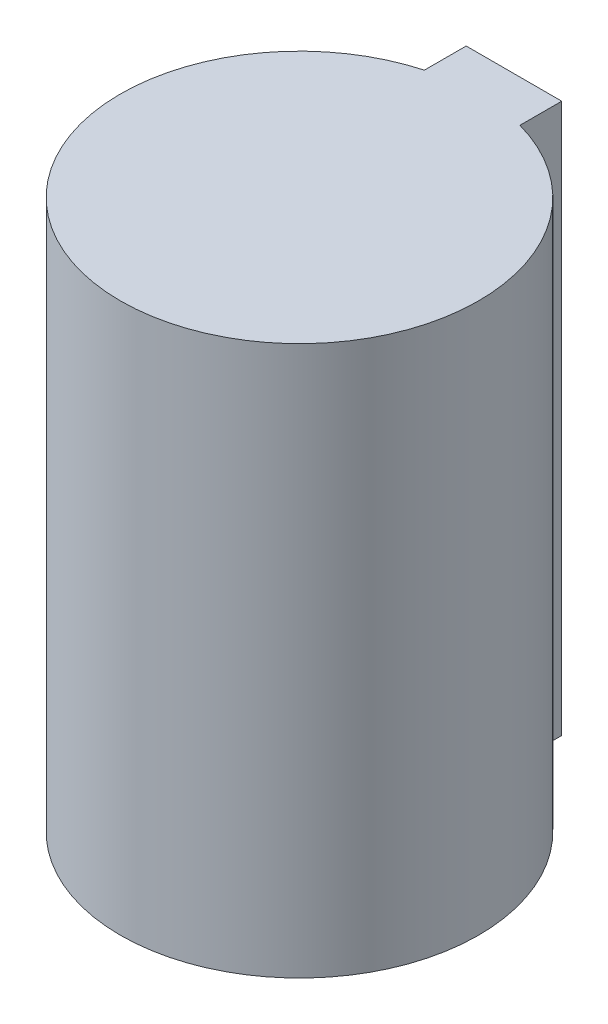
ISO-10303-21;
HEADER;
FILE_DESCRIPTION(('STEP AP214'),'2;1');
FILE_NAME('part.step','',(''),(''),'','','');
FILE_SCHEMA(('AUTOMOTIVE_DESIGN { 1 0 10303 214 1 1 1 1 }'));
ENDSEC;
DATA;
#1=APPLICATION_CONTEXT('core data for automotive mechanical design processes');
#2=APPLICATION_PROTOCOL_DEFINITION('international standard','automotive_design',2000,#1);
#3=PRODUCT_CONTEXT('',#1,'mechanical');
#4=PRODUCT('Part','Part','',(#3));
#5=PRODUCT_RELATED_PRODUCT_CATEGORY('part','',(#4));
#6=PRODUCT_DEFINITION_FORMATION('','',#4);
#7=PRODUCT_DEFINITION_CONTEXT('part definition',#1,'design');
#8=PRODUCT_DEFINITION('design','',#6,#7);
#9=PRODUCT_DEFINITION_SHAPE('','',#8);
#10=(LENGTH_UNIT() NAMED_UNIT(*) SI_UNIT(.MILLI.,.METRE.));
#11=(NAMED_UNIT(*) PLANE_ANGLE_UNIT() SI_UNIT($,.RADIAN.));
#12=(NAMED_UNIT(*) SI_UNIT($,.STERADIAN.) SOLID_ANGLE_UNIT());
#13=UNCERTAINTY_MEASURE_WITH_UNIT(LENGTH_MEASURE(1.E-05),#10,'distance_accuracy_value','');
#14=(GEOMETRIC_REPRESENTATION_CONTEXT(3) GLOBAL_UNCERTAINTY_ASSIGNED_CONTEXT((#13)) GLOBAL_UNIT_ASSIGNED_CONTEXT((#10,
#11,#12)) REPRESENTATION_CONTEXT('',''));
#15=CARTESIAN_POINT('',(0.,0.,0.));
#16=DIRECTION('',(0.,0.,1.));
#17=DIRECTION('',(1.,0.,0.));
#18=AXIS2_PLACEMENT_3D('',#15,#16,#17);
#19=CARTESIAN_POINT('',(-2.,23.,-8.97841614740048));
#20=DIRECTION('',(1.,0.,0.));
#21=DIRECTION('',(0.,0.,-1.));
#22=AXIS2_PLACEMENT_3D('',#19,#20,#21);
#23=PLANE('',#22);
#24=DIRECTION('',(0.,0.,1.));
#25=VECTOR('',#24,1.);
#26=CARTESIAN_POINT('',(-2.,0.,-8.97841614740048));
#27=LINE('',#26,#25);
#28=CARTESIAN_POINT('',(-2.,0.,-8.97841614740048));
#29=VERTEX_POINT('',#28);
#30=CARTESIAN_POINT('',(-2.,0.,-7.22841614740048));
#31=VERTEX_POINT('',#30);
#32=EDGE_CURVE('E107',#29,#31,#27,.T.);
#33=ORIENTED_EDGE('',*,*,#32,.T.);
#34=DIRECTION('',(0.,-1.,0.));
#35=VECTOR('',#34,1.);
#36=CARTESIAN_POINT('',(-2.,23.,-7.22841614740048));
#37=LINE('',#36,#35);
#38=CARTESIAN_POINT('',(-2.,23.,-7.22841614740048));
#39=VERTEX_POINT('',#38);
#40=EDGE_CURVE('E11',#39,#31,#37,.T.);
#41=ORIENTED_EDGE('',*,*,#40,.F.);
#42=DIRECTION('',(0.,0.,1.));
#43=VECTOR('',#42,1.);
#44=CARTESIAN_POINT('',(-2.,23.,-8.97841614740048));
#45=LINE('',#44,#43);
#46=CARTESIAN_POINT('',(-2.,23.,-8.97841614740048));
#47=VERTEX_POINT('',#46);
#48=EDGE_CURVE('E91',#47,#39,#45,.T.);
#49=ORIENTED_EDGE('',*,*,#48,.F.);
#50=DIRECTION('',(0.,-1.,0.));
#51=VECTOR('',#50,1.);
#52=CARTESIAN_POINT('',(-2.,23.,-8.97841614740048));
#53=LINE('',#52,#51);
#54=EDGE_CURVE('E103',#47,#29,#53,.T.);
#55=ORIENTED_EDGE('',*,*,#54,.T.);
#56=EDGE_LOOP('',(#33,#41,#49,#55));
#57=FACE_BOUND('',#56,.T.);
#58=ADVANCED_FACE('F39',(#57),#23,.F.);
#59=CARTESIAN_POINT('',(0.,23.,0.));
#60=DIRECTION('',(0.,-1.,0.));
#61=DIRECTION('',(0.,0.,-1.));
#62=AXIS2_PLACEMENT_3D('',#59,#60,#61);
#63=CYLINDRICAL_SURFACE('',#62,7.5);
#64=CARTESIAN_POINT('',(0.,0.,0.));
#65=DIRECTION('',(0.,1.,0.));
#66=DIRECTION('',(0.,0.,1.));
#67=AXIS2_PLACEMENT_3D('',#64,#65,#66);
#68=CIRCLE('',#67,7.5);
#69=CARTESIAN_POINT('',(2.,0.,-7.22841614740048));
#70=VERTEX_POINT('',#69);
#71=EDGE_CURVE('E96',#31,#70,#68,.T.);
#72=ORIENTED_EDGE('',*,*,#71,.T.);
#73=DIRECTION('',(0.,-1.,0.));
#74=VECTOR('',#73,1.);
#75=CARTESIAN_POINT('',(2.,23.,-7.22841614740048));
#76=LINE('',#75,#74);
#77=CARTESIAN_POINT('',(2.,23.,-7.22841614740048));
#78=VERTEX_POINT('',#77);
#79=EDGE_CURVE('E48',#78,#70,#76,.T.);
#80=ORIENTED_EDGE('',*,*,#79,.F.);
#81=CARTESIAN_POINT('',(0.,23.,0.));
#82=DIRECTION('',(0.,1.,0.));
#83=DIRECTION('',(0.,0.,1.));
#84=AXIS2_PLACEMENT_3D('',#81,#82,#83);
#85=CIRCLE('',#84,7.5);
#86=EDGE_CURVE('E86',#39,#78,#85,.T.);
#87=ORIENTED_EDGE('',*,*,#86,.F.);
#88=ORIENTED_EDGE('',*,*,#40,.T.);
#89=EDGE_LOOP('',(#72,#80,#87,#88));
#90=FACE_BOUND('',#89,.T.);
#91=ADVANCED_FACE('F95',(#90),#63,.T.);
#92=CARTESIAN_POINT('',(2.,23.,-8.97841614740048));
#93=DIRECTION('',(-1.,0.,0.));
#94=DIRECTION('',(0.,0.,1.));
#95=AXIS2_PLACEMENT_3D('',#92,#93,#94);
#96=PLANE('',#95);
#97=DIRECTION('',(0.,0.,-1.));
#98=VECTOR('',#97,1.);
#99=CARTESIAN_POINT('',(2.,0.,-8.97841614740048));
#100=LINE('',#99,#98);
#101=CARTESIAN_POINT('',(2.,0.,-8.97841614740048));
#102=VERTEX_POINT('',#101);
#103=EDGE_CURVE('E73',#70,#102,#100,.T.);
#104=ORIENTED_EDGE('',*,*,#103,.T.);
#105=DIRECTION('',(0.,-1.,0.));
#106=VECTOR('',#105,1.);
#107=CARTESIAN_POINT('',(2.,23.,-8.97841614740048));
#108=LINE('',#107,#106);
#109=CARTESIAN_POINT('',(2.,23.,-8.97841614740048));
#110=VERTEX_POINT('',#109);
#111=EDGE_CURVE('E98',#110,#102,#108,.T.);
#112=ORIENTED_EDGE('',*,*,#111,.F.);
#113=DIRECTION('',(0.,0.,-1.));
#114=VECTOR('',#113,1.);
#115=CARTESIAN_POINT('',(2.,23.,-8.97841614740048));
#116=LINE('',#115,#114);
#117=EDGE_CURVE('E89',#78,#110,#116,.T.);
#118=ORIENTED_EDGE('',*,*,#117,.F.);
#119=ORIENTED_EDGE('',*,*,#79,.T.);
#120=EDGE_LOOP('',(#104,#112,#118,#119));
#121=FACE_BOUND('',#120,.T.);
#122=ADVANCED_FACE('F99',(#121),#96,.F.);
#123=CARTESIAN_POINT('',(-2.,23.,-8.97841614740048));
#124=DIRECTION('',(0.,0.,1.));
#125=DIRECTION('',(1.,0.,0.));
#126=AXIS2_PLACEMENT_3D('',#123,#124,#125);
#127=PLANE('',#126);
#128=DIRECTION('',(-1.,0.,0.));
#129=VECTOR('',#128,1.);
#130=CARTESIAN_POINT('',(-2.,0.,-8.97841614740048));
#131=LINE('',#130,#129);
#132=EDGE_CURVE('E79',#102,#29,#131,.T.);
#133=ORIENTED_EDGE('',*,*,#132,.T.);
#134=ORIENTED_EDGE('',*,*,#54,.F.);
#135=DIRECTION('',(-1.,0.,0.));
#136=VECTOR('',#135,1.);
#137=CARTESIAN_POINT('',(-2.,23.,-8.97841614740048));
#138=LINE('',#137,#136);
#139=EDGE_CURVE('E56',#110,#47,#138,.T.);
#140=ORIENTED_EDGE('',*,*,#139,.F.);
#141=ORIENTED_EDGE('',*,*,#111,.T.);
#142=EDGE_LOOP('',(#133,#134,#140,#141));
#143=FACE_BOUND('',#142,.T.);
#144=ADVANCED_FACE('F120',(#143),#127,.F.);
#145=CARTESIAN_POINT('',(0.,23.,0.));
#146=DIRECTION('',(0.,1.,0.));
#147=DIRECTION('',(0.,0.,1.));
#148=AXIS2_PLACEMENT_3D('',#145,#146,#147);
#149=PLANE('',#148);
#150=ORIENTED_EDGE('',*,*,#48,.T.);
#151=ORIENTED_EDGE('',*,*,#86,.T.);
#152=ORIENTED_EDGE('',*,*,#117,.T.);
#153=ORIENTED_EDGE('',*,*,#139,.T.);
#154=EDGE_LOOP('',(#150,#151,#152,#153));
#155=FACE_BOUND('',#154,.T.);
#156=ADVANCED_FACE('F87',(#155),#149,.T.);
#157=CARTESIAN_POINT('',(0.,0.,0.));
#158=DIRECTION('',(0.,1.,0.));
#159=DIRECTION('',(0.,0.,1.));
#160=AXIS2_PLACEMENT_3D('',#157,#158,#159);
#161=PLANE('',#160);
#162=ORIENTED_EDGE('',*,*,#32,.F.);
#163=ORIENTED_EDGE('',*,*,#132,.F.);
#164=ORIENTED_EDGE('',*,*,#103,.F.);
#165=ORIENTED_EDGE('',*,*,#71,.F.);
#166=EDGE_LOOP('',(#162,#163,#164,#165));
#167=FACE_BOUND('',#166,.T.);
#168=ADVANCED_FACE('F123',(#167),#161,.F.);
#169=CLOSED_SHELL('',(#58,#91,#122,#144,#156,#168));
#170=MANIFOLD_SOLID_BREP('B2',#169);
#171=ADVANCED_BREP_SHAPE_REPRESENTATION('',(#18,#170),#14);
#172=SHAPE_DEFINITION_REPRESENTATION(#9,#171);
ENDSEC;
END-ISO-10303-21;
